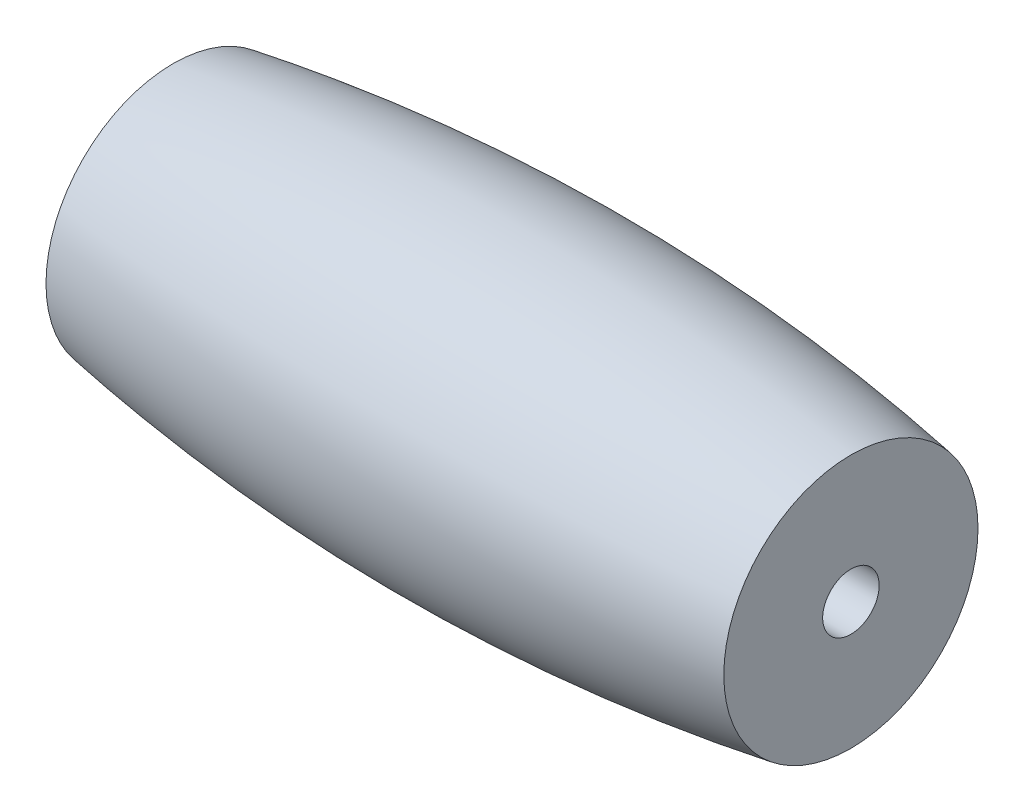
ISO-10303-21;
HEADER;
FILE_DESCRIPTION(('STEP AP214'),'2;1');
FILE_NAME('part.step','',(''),(''),'','','');
FILE_SCHEMA(('AUTOMOTIVE_DESIGN { 1 0 10303 214 1 1 1 1 }'));
ENDSEC;
DATA;
#1=APPLICATION_CONTEXT('core data for automotive mechanical design processes');
#2=APPLICATION_PROTOCOL_DEFINITION('international standard','automotive_design',2000,#1);
#3=PRODUCT_CONTEXT('',#1,'mechanical');
#4=PRODUCT('Part','Part','',(#3));
#5=PRODUCT_RELATED_PRODUCT_CATEGORY('part','',(#4));
#6=PRODUCT_DEFINITION_FORMATION('','',#4);
#7=PRODUCT_DEFINITION_CONTEXT('part definition',#1,'design');
#8=PRODUCT_DEFINITION('design','',#6,#7);
#9=PRODUCT_DEFINITION_SHAPE('','',#8);
#10=(LENGTH_UNIT() NAMED_UNIT(*) SI_UNIT(.MILLI.,.METRE.));
#11=(NAMED_UNIT(*) PLANE_ANGLE_UNIT() SI_UNIT($,.RADIAN.));
#12=(NAMED_UNIT(*) SI_UNIT($,.STERADIAN.) SOLID_ANGLE_UNIT());
#13=UNCERTAINTY_MEASURE_WITH_UNIT(LENGTH_MEASURE(1.E-05),#10,'distance_accuracy_value','');
#14=(GEOMETRIC_REPRESENTATION_CONTEXT(3) GLOBAL_UNCERTAINTY_ASSIGNED_CONTEXT((#13)) GLOBAL_UNIT_ASSIGNED_CONTEXT((#10,
#11,#12)) REPRESENTATION_CONTEXT('',''));
#15=CARTESIAN_POINT('',(0.,0.,0.));
#16=DIRECTION('',(0.,0.,1.));
#17=DIRECTION('',(1.,0.,0.));
#18=AXIS2_PLACEMENT_3D('',#15,#16,#17);
#19=CARTESIAN_POINT('',(7.54166666666668,2.,0.));
#20=DIRECTION('',(1.,0.,0.));
#21=DIRECTION('',(0.,0.,-1.));
#22=AXIS2_PLACEMENT_3D('',#19,#20,#21);
#23=PLANE('',#22);
#24=CARTESIAN_POINT('',(7.54166666666668,0.,0.));
#25=DIRECTION('',(1.,0.,0.));
#26=DIRECTION('',(0.,0.,-1.));
#27=AXIS2_PLACEMENT_3D('',#24,#25,#26);
#28=CIRCLE('',#27,9.00000000000001);
#29=CARTESIAN_POINT('',(7.54166666666668,0.,-9.00000000000001));
#30=VERTEX_POINT('',#29);
#31=EDGE_CURVE('E56',#30,#30,#28,.T.);
#32=ORIENTED_EDGE('',*,*,#31,.T.);
#33=EDGE_LOOP('',(#32));
#34=FACE_BOUND('',#33,.T.);
#35=CARTESIAN_POINT('',(7.54166666666667,0.,0.));
#36=DIRECTION('',(1.,0.,0.));
#37=DIRECTION('',(0.,0.,-1.));
#38=AXIS2_PLACEMENT_3D('',#35,#36,#37);
#39=CIRCLE('',#38,2.);
#40=CARTESIAN_POINT('',(7.54166666666667,0.,-2.));
#41=VERTEX_POINT('',#40);
#42=EDGE_CURVE('E12',#41,#41,#39,.T.);
#43=ORIENTED_EDGE('',*,*,#42,.F.);
#44=EDGE_LOOP('',(#43));
#45=FACE_BOUND('',#44,.T.);
#46=ADVANCED_FACE('F42',(#34,#45),#23,.T.);
#47=CARTESIAN_POINT('',(11.25,0.,0.));
#48=DIRECTION('',(1.,0.,0.));
#49=DIRECTION('',(0.,0.,-1.));
#50=AXIS2_PLACEMENT_3D('',#47,#48,#49);
#51=CYLINDRICAL_SURFACE('',#50,2.);
#52=ORIENTED_EDGE('',*,*,#42,.T.);
#53=EDGE_LOOP('',(#52));
#54=FACE_BOUND('',#53,.T.);
#55=CARTESIAN_POINT('',(-40.4583333333333,0.,0.));
#56=DIRECTION('',(1.,0.,0.));
#57=DIRECTION('',(0.,0.,-1.));
#58=AXIS2_PLACEMENT_3D('',#55,#56,#57);
#59=CIRCLE('',#58,2.);
#60=CARTESIAN_POINT('',(-40.4583333333333,0.,-2.));
#61=VERTEX_POINT('',#60);
#62=EDGE_CURVE('E48',#61,#61,#59,.T.);
#63=ORIENTED_EDGE('',*,*,#62,.F.);
#64=EDGE_LOOP('',(#63));
#65=FACE_BOUND('',#64,.T.);
#66=ADVANCED_FACE('F72',(#54,#65),#51,.F.);
#67=CARTESIAN_POINT('',(-40.4583333333333,2.,0.));
#68=DIRECTION('',(-1.,0.,0.));
#69=DIRECTION('',(0.,0.,1.));
#70=AXIS2_PLACEMENT_3D('',#67,#68,#69);
#71=PLANE('',#70);
#72=ORIENTED_EDGE('',*,*,#62,.T.);
#73=EDGE_LOOP('',(#72));
#74=FACE_BOUND('',#73,.T.);
#75=CARTESIAN_POINT('',(-40.4583333333333,0.,0.));
#76=DIRECTION('',(1.,0.,0.));
#77=DIRECTION('',(0.,0.,-1.));
#78=AXIS2_PLACEMENT_3D('',#75,#76,#77);
#79=CIRCLE('',#78,9.);
#80=CARTESIAN_POINT('',(-40.4583333333333,0.,-9.));
#81=VERTEX_POINT('',#80);
#82=EDGE_CURVE('E52',#81,#81,#79,.T.);
#83=ORIENTED_EDGE('',*,*,#82,.F.);
#84=EDGE_LOOP('',(#83));
#85=FACE_BOUND('',#84,.T.);
#86=ADVANCED_FACE('F66',(#74,#85),#71,.T.);
#87=CARTESIAN_POINT('',(-16.4583333333333,0.,0.));
#88=DIRECTION('',(1.,0.,0.));
#89=DIRECTION('',(0.,0.,-1.));
#90=AXIS2_PLACEMENT_3D('',#87,#88,#89);
#91=DEGENERATE_TOROIDAL_SURFACE('',#90,134.,145.,.F.);
#92=ORIENTED_EDGE('',*,*,#82,.T.);
#93=EDGE_LOOP('',(#92));
#94=FACE_BOUND('',#93,.T.);
#95=ORIENTED_EDGE('',*,*,#31,.F.);
#96=EDGE_LOOP('',(#95));
#97=FACE_BOUND('',#96,.T.);
#98=ADVANCED_FACE('F64',(#94,#97),#91,.F.);
#99=CLOSED_SHELL('',(#46,#66,#86,#98));
#100=MANIFOLD_SOLID_BREP('B2',#99);
#101=ADVANCED_BREP_SHAPE_REPRESENTATION('',(#18,#100),#14);
#102=SHAPE_DEFINITION_REPRESENTATION(#9,#101);
ENDSEC;
END-ISO-10303-21;
